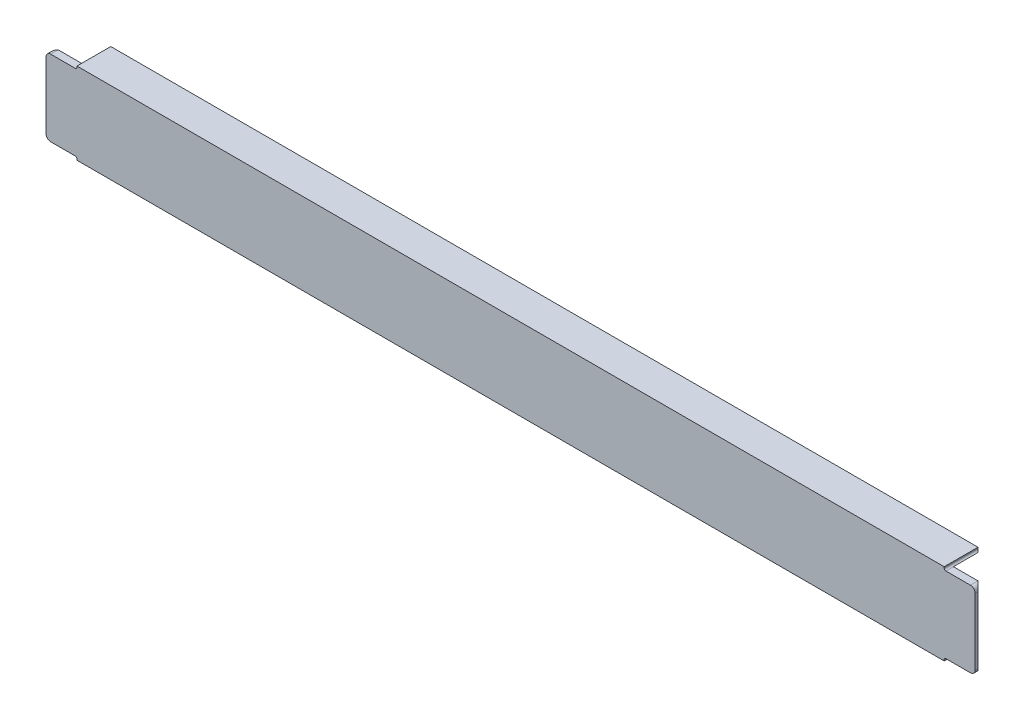
ISO-10303-21;
HEADER;
FILE_DESCRIPTION(('STEP AP214'),'2;1');
FILE_NAME('part.step','',(''),(''),'','','');
FILE_SCHEMA(('AUTOMOTIVE_DESIGN { 1 0 10303 214 1 1 1 1 }'));
ENDSEC;
DATA;
#1=APPLICATION_CONTEXT('core data for automotive mechanical design processes');
#2=APPLICATION_PROTOCOL_DEFINITION('international standard','automotive_design',2000,#1);
#3=PRODUCT_CONTEXT('',#1,'mechanical');
#4=PRODUCT('Part','Part','',(#3));
#5=PRODUCT_RELATED_PRODUCT_CATEGORY('part','',(#4));
#6=PRODUCT_DEFINITION_FORMATION('','',#4);
#7=PRODUCT_DEFINITION_CONTEXT('part definition',#1,'design');
#8=PRODUCT_DEFINITION('design','',#6,#7);
#9=PRODUCT_DEFINITION_SHAPE('','',#8);
#10=(LENGTH_UNIT() NAMED_UNIT(*) SI_UNIT(.MILLI.,.METRE.));
#11=(NAMED_UNIT(*) PLANE_ANGLE_UNIT() SI_UNIT($,.RADIAN.));
#12=(NAMED_UNIT(*) SI_UNIT($,.STERADIAN.) SOLID_ANGLE_UNIT());
#13=UNCERTAINTY_MEASURE_WITH_UNIT(LENGTH_MEASURE(1.E-05),#10,'distance_accuracy_value','');
#14=(GEOMETRIC_REPRESENTATION_CONTEXT(3) GLOBAL_UNCERTAINTY_ASSIGNED_CONTEXT((#13)) GLOBAL_UNIT_ASSIGNED_CONTEXT((#10,
#11,#12)) REPRESENTATION_CONTEXT('',''));
#15=CARTESIAN_POINT('',(0.,0.,0.));
#16=DIRECTION('',(0.,0.,1.));
#17=DIRECTION('',(1.,0.,0.));
#18=AXIS2_PLACEMENT_3D('',#15,#16,#17);
#19=CARTESIAN_POINT('',(-948.422417281431,-4.9,3.));
#20=DIRECTION('',(0.,-1.,0.));
#21=DIRECTION('',(0.,0.,-1.));
#22=AXIS2_PLACEMENT_3D('',#19,#20,#21);
#23=PLANE('',#22);
#24=DIRECTION('',(0.,0.,1.));
#25=VECTOR('',#24,1.);
#26=CARTESIAN_POINT('',(-746.783643365314,-4.89999999999959,-250.));
#27=LINE('',#26,#25);
#28=CARTESIAN_POINT('',(-746.783643365314,-4.89999999999959,3.));
#29=VERTEX_POINT('',#28);
#30=CARTESIAN_POINT('',(-746.783643365314,-4.89999999999959,45.1));
#31=VERTEX_POINT('',#30);
#32=EDGE_CURVE('E295',#29,#31,#27,.T.);
#33=ORIENTED_EDGE('',*,*,#32,.F.);
#34=DIRECTION('',(1.,0.,0.));
#35=VECTOR('',#34,1.);
#36=CARTESIAN_POINT('',(-948.422417281431,-4.9,3.));
#37=LINE('',#36,#35);
#38=CARTESIAN_POINT('',(746.783643365314,-4.89999999999959,3.));
#39=VERTEX_POINT('',#38);
#40=EDGE_CURVE('E359',#29,#39,#37,.T.);
#41=ORIENTED_EDGE('',*,*,#40,.T.);
#42=DIRECTION('',(0.,0.,1.));
#43=VECTOR('',#42,1.);
#44=CARTESIAN_POINT('',(746.783643365314,-4.89999999999959,-250.));
#45=LINE('',#44,#43);
#46=CARTESIAN_POINT('',(746.783643365314,-4.89999999999959,45.1));
#47=VERTEX_POINT('',#46);
#48=EDGE_CURVE('E441',#39,#47,#45,.T.);
#49=ORIENTED_EDGE('',*,*,#48,.T.);
#50=DIRECTION('',(1.,0.,0.));
#51=VECTOR('',#50,1.);
#52=CARTESIAN_POINT('',(-948.422417281431,-4.90000000000001,45.1));
#53=LINE('',#52,#51);
#54=EDGE_CURVE('E362',#31,#47,#53,.T.);
#55=ORIENTED_EDGE('',*,*,#54,.F.);
#56=EDGE_LOOP('',(#33,#41,#49,#55));
#57=FACE_BOUND('',#56,.T.);
#58=ADVANCED_FACE('F41',(#57),#23,.T.);
#59=CARTESIAN_POINT('',(-948.422417281431,-135.1,3.));
#60=DIRECTION('',(0.,1.,0.));
#61=DIRECTION('',(0.,0.,1.));
#62=AXIS2_PLACEMENT_3D('',#59,#60,#61);
#63=PLANE('',#62);
#64=DIRECTION('',(1.,0.,0.));
#65=VECTOR('',#64,1.);
#66=CARTESIAN_POINT('',(-948.422417281431,-135.1,3.));
#67=LINE('',#66,#65);
#68=CARTESIAN_POINT('',(-746.783643365314,-135.1,3.));
#69=VERTEX_POINT('',#68);
#70=CARTESIAN_POINT('',(746.783643365314,-135.1,3.));
#71=VERTEX_POINT('',#70);
#72=EDGE_CURVE('E374',#69,#71,#67,.T.);
#73=ORIENTED_EDGE('',*,*,#72,.F.);
#74=DIRECTION('',(0.,0.,1.));
#75=VECTOR('',#74,1.);
#76=CARTESIAN_POINT('',(-746.783643365314,-135.1,-250.));
#77=LINE('',#76,#75);
#78=CARTESIAN_POINT('',(-746.783643365314,-135.1,45.1));
#79=VERTEX_POINT('',#78);
#80=EDGE_CURVE('E307',#69,#79,#77,.T.);
#81=ORIENTED_EDGE('',*,*,#80,.T.);
#82=DIRECTION('',(1.,0.,0.));
#83=VECTOR('',#82,1.);
#84=CARTESIAN_POINT('',(-948.422417281431,-135.1,45.1));
#85=LINE('',#84,#83);
#86=CARTESIAN_POINT('',(746.783643365314,-135.1,45.1));
#87=VERTEX_POINT('',#86);
#88=EDGE_CURVE('E371',#79,#87,#85,.T.);
#89=ORIENTED_EDGE('',*,*,#88,.T.);
#90=DIRECTION('',(0.,0.,1.));
#91=VECTOR('',#90,1.);
#92=CARTESIAN_POINT('',(746.783643365314,-135.1,-250.));
#93=LINE('',#92,#91);
#94=EDGE_CURVE('E461',#71,#87,#93,.T.);
#95=ORIENTED_EDGE('',*,*,#94,.F.);
#96=EDGE_LOOP('',(#73,#81,#89,#95));
#97=FACE_BOUND('',#96,.T.);
#98=ADVANCED_FACE('F510',(#97),#63,.T.);
#99=CARTESIAN_POINT('',(-796.883643365314,-12.8999999999996,-250.));
#100=DIRECTION('',(1.,0.,0.));
#101=DIRECTION('',(0.,1.,0.));
#102=AXIS2_PLACEMENT_3D('',#99,#100,#101);
#103=PLANE('',#102);
#104=DIRECTION('',(0.,1.,0.));
#105=VECTOR('',#104,1.);
#106=CARTESIAN_POINT('',(-796.883643365314,-140.,57.9999999999999));
#107=LINE('',#106,#105);
#108=CARTESIAN_POINT('',(-796.883643365314,-127.1,57.9999999999999));
#109=VERTEX_POINT('',#108);
#110=CARTESIAN_POINT('',(-796.883643365314,-12.8999999999996,57.9999999999999));
#111=VERTEX_POINT('',#110);
#112=EDGE_CURVE('E352',#109,#111,#107,.T.);
#113=ORIENTED_EDGE('',*,*,#112,.T.);
#114=DIRECTION('',(0.,0.,1.));
#115=VECTOR('',#114,1.);
#116=CARTESIAN_POINT('',(-796.883643365314,-12.8999999999996,-250.));
#117=LINE('',#116,#115);
#118=CARTESIAN_POINT('',(-796.883643365314,-12.9,53.1));
#119=VERTEX_POINT('',#118);
#120=EDGE_CURVE('E389',#111,#119,#117,.F.);
#121=ORIENTED_EDGE('',*,*,#120,.T.);
#122=DIRECTION('',(0.,-1.,0.));
#123=VECTOR('',#122,1.);
#124=CARTESIAN_POINT('',(-796.883643365314,-12.9,53.1));
#125=LINE('',#124,#123);
#126=CARTESIAN_POINT('',(-796.883643365314,-127.1,53.1));
#127=VERTEX_POINT('',#126);
#128=EDGE_CURVE('E348',#119,#127,#125,.T.);
#129=ORIENTED_EDGE('',*,*,#128,.T.);
#130=DIRECTION('',(0.,0.,1.));
#131=VECTOR('',#130,1.);
#132=CARTESIAN_POINT('',(-796.883643365314,-127.1,-250.));
#133=LINE('',#132,#131);
#134=EDGE_CURVE('E386',#109,#127,#133,.F.);
#135=ORIENTED_EDGE('',*,*,#134,.F.);
#136=EDGE_LOOP('',(#113,#121,#129,#135));
#137=FACE_BOUND('',#136,.T.);
#138=ADVANCED_FACE('F515',(#137),#103,.F.);
#139=CARTESIAN_POINT('',(-948.422417281431,0.,57.9999999999999));
#140=DIRECTION('',(0.,1.,0.));
#141=DIRECTION('',(0.,0.,1.));
#142=AXIS2_PLACEMENT_3D('',#139,#140,#141);
#143=PLANE('',#142);
#144=DIRECTION('',(0.,0.,1.));
#145=VECTOR('',#144,1.);
#146=CARTESIAN_POINT('',(-743.783643365314,4.16333634234434E-13,-250.));
#147=LINE('',#146,#145);
#148=CARTESIAN_POINT('',(-743.783643365314,4.16333634234434E-13,0.));
#149=VERTEX_POINT('',#148);
#150=CARTESIAN_POINT('',(-743.783643365314,4.16333634234434E-13,57.9999999999999));
#151=VERTEX_POINT('',#150);
#152=EDGE_CURVE('E287',#149,#151,#147,.T.);
#153=ORIENTED_EDGE('',*,*,#152,.T.);
#154=DIRECTION('',(1.,0.,0.));
#155=VECTOR('',#154,1.);
#156=CARTESIAN_POINT('',(-948.422417281431,0.,57.9999999999999));
#157=LINE('',#156,#155);
#158=CARTESIAN_POINT('',(743.783643365314,4.16333634234434E-13,57.9999999999999));
#159=VERTEX_POINT('',#158);
#160=EDGE_CURVE('E347',#151,#159,#157,.T.);
#161=ORIENTED_EDGE('',*,*,#160,.T.);
#162=DIRECTION('',(0.,0.,1.));
#163=VECTOR('',#162,1.);
#164=CARTESIAN_POINT('',(743.783643365314,4.16333634234434E-13,-250.));
#165=LINE('',#164,#163);
#166=CARTESIAN_POINT('',(743.783643365314,4.16333634234434E-13,0.));
#167=VERTEX_POINT('',#166);
#168=EDGE_CURVE('E424',#167,#159,#165,.T.);
#169=ORIENTED_EDGE('',*,*,#168,.F.);
#170=DIRECTION('',(1.,0.,0.));
#171=VECTOR('',#170,1.);
#172=CARTESIAN_POINT('',(-948.422417281431,0.,0.));
#173=LINE('',#172,#171);
#174=EDGE_CURVE('E353',#149,#167,#173,.T.);
#175=ORIENTED_EDGE('',*,*,#174,.F.);
#176=EDGE_LOOP('',(#153,#161,#169,#175));
#177=FACE_BOUND('',#176,.T.);
#178=ADVANCED_FACE('F43',(#177),#143,.T.);
#179=CARTESIAN_POINT('',(-948.422417281431,0.,0.));
#180=DIRECTION('',(0.,0.,-1.));
#181=DIRECTION('',(0.,1.,0.));
#182=AXIS2_PLACEMENT_3D('',#179,#180,#181);
#183=PLANE('',#182);
#184=DIRECTION('',(0.,-1.,0.));
#185=VECTOR('',#184,1.);
#186=CARTESIAN_POINT('',(-743.783643365314,7.47350916226102E-13,0.));
#187=LINE('',#186,#185);
#188=CARTESIAN_POINT('',(-743.783643365314,-1.89999999999958,0.));
#189=VERTEX_POINT('',#188);
#190=EDGE_CURVE('E344',#149,#189,#187,.T.);
#191=ORIENTED_EDGE('',*,*,#190,.F.);
#192=ORIENTED_EDGE('',*,*,#174,.T.);
#193=DIRECTION('',(0.,-1.,0.));
#194=VECTOR('',#193,1.);
#195=CARTESIAN_POINT('',(743.783643365314,7.47350916226102E-13,0.));
#196=LINE('',#195,#194);
#197=CARTESIAN_POINT('',(743.783643365314,-1.89999999999958,0.));
#198=VERTEX_POINT('',#197);
#199=EDGE_CURVE('E245',#167,#198,#196,.T.);
#200=ORIENTED_EDGE('',*,*,#199,.T.);
#201=DIRECTION('',(1.,0.,0.));
#202=VECTOR('',#201,1.);
#203=CARTESIAN_POINT('',(-948.422417281431,-1.9,0.));
#204=LINE('',#203,#202);
#205=EDGE_CURVE('E356',#189,#198,#204,.T.);
#206=ORIENTED_EDGE('',*,*,#205,.F.);
#207=EDGE_LOOP('',(#191,#192,#200,#206));
#208=FACE_BOUND('',#207,.T.);
#209=ADVANCED_FACE('F427',(#208),#183,.T.);
#210=CARTESIAN_POINT('',(-948.422417281431,-1.9,3.));
#211=DIRECTION('',(1.,0.,0.));
#212=DIRECTION('',(0.,0.,-1.));
#213=AXIS2_PLACEMENT_3D('',#210,#211,#212);
#214=CYLINDRICAL_SURFACE('',#213,3.00000000000001);
#215=CARTESIAN_POINT('',(-746.783643365314,-1.89999999999979,3.));
#216=DIRECTION('',(0.707106781186547,0.,0.707106781186547));
#217=DIRECTION('',(0.707106781186547,0.,-0.707106781186547));
#218=AXIS2_PLACEMENT_3D('',#215,#216,#217);
#219=ELLIPSE('',#218,4.24264068711929,3.00000000000001);
#220=EDGE_CURVE('E341',#189,#29,#219,.F.);
#221=ORIENTED_EDGE('',*,*,#220,.F.);
#222=ORIENTED_EDGE('',*,*,#205,.T.);
#223=CARTESIAN_POINT('',(746.783643365314,-1.89999999999979,3.));
#224=DIRECTION('',(0.707106781186547,0.,-0.707106781186547));
#225=DIRECTION('',(-0.707106781186547,0.,-0.707106781186547));
#226=AXIS2_PLACEMENT_3D('',#223,#224,#225);
#227=ELLIPSE('',#226,4.24264068711929,3.00000000000001);
#228=EDGE_CURVE('E241',#198,#39,#227,.F.);
#229=ORIENTED_EDGE('',*,*,#228,.T.);
#230=ORIENTED_EDGE('',*,*,#40,.F.);
#231=EDGE_LOOP('',(#221,#222,#229,#230));
#232=FACE_BOUND('',#231,.T.);
#233=ADVANCED_FACE('F431',(#232),#214,.T.);
#234=CARTESIAN_POINT('',(-948.422417281431,-12.9,45.1));
#235=DIRECTION('',(1.,0.,0.));
#236=DIRECTION('',(0.,0.,-1.));
#237=AXIS2_PLACEMENT_3D('',#234,#235,#236);
#238=CYLINDRICAL_SURFACE('',#237,8.);
#239=CARTESIAN_POINT('',(-788.883643365314,-12.8999999999998,45.1));
#240=DIRECTION('',(0.707106781186547,0.,0.707106781186547));
#241=DIRECTION('',(0.707106781186547,0.,-0.707106781186547));
#242=AXIS2_PLACEMENT_3D('',#239,#240,#241);
#243=ELLIPSE('',#242,11.3137084989848,8.);
#244=CARTESIAN_POINT('',(-788.883643365314,-4.89999999999959,45.1));
#245=VERTEX_POINT('',#244);
#246=EDGE_CURVE('E65',#245,#119,#243,.T.);
#247=ORIENTED_EDGE('',*,*,#246,.F.);
#248=DIRECTION('',(1.,0.,0.));
#249=VECTOR('',#248,1.);
#250=CARTESIAN_POINT('',(-948.422417281431,-4.8999999999998,45.1));
#251=LINE('',#250,#249);
#252=EDGE_CURVE('E331',#245,#31,#251,.T.);
#253=ORIENTED_EDGE('',*,*,#252,.T.);
#254=ORIENTED_EDGE('',*,*,#54,.T.);
#255=DIRECTION('',(-1.,0.,0.));
#256=VECTOR('',#255,1.);
#257=CARTESIAN_POINT('',(948.422417281431,-4.8999999999998,45.1));
#258=LINE('',#257,#256);
#259=CARTESIAN_POINT('',(788.883643365314,-4.89999999999959,45.1));
#260=VERTEX_POINT('',#259);
#261=EDGE_CURVE('E221',#260,#47,#258,.T.);
#262=ORIENTED_EDGE('',*,*,#261,.F.);
#263=CARTESIAN_POINT('',(788.883643365314,-12.8999999999998,45.1));
#264=DIRECTION('',(0.707106781186547,0.,-0.707106781186547));
#265=DIRECTION('',(-0.707106781186547,0.,-0.707106781186547));
#266=AXIS2_PLACEMENT_3D('',#263,#264,#265);
#267=ELLIPSE('',#266,11.3137084989848,8.);
#268=CARTESIAN_POINT('',(796.883643365314,-12.9,53.1));
#269=VERTEX_POINT('',#268);
#270=EDGE_CURVE('E222',#260,#269,#267,.T.);
#271=ORIENTED_EDGE('',*,*,#270,.T.);
#272=DIRECTION('',(1.,0.,0.));
#273=VECTOR('',#272,1.);
#274=CARTESIAN_POINT('',(-948.422417281431,-12.9,53.1));
#275=LINE('',#274,#273);
#276=EDGE_CURVE('E365',#119,#269,#275,.T.);
#277=ORIENTED_EDGE('',*,*,#276,.F.);
#278=EDGE_LOOP('',(#247,#253,#254,#262,#271,#277));
#279=FACE_BOUND('',#278,.T.);
#280=ADVANCED_FACE('F493',(#279),#238,.F.);
#281=CARTESIAN_POINT('',(-948.422417281431,-12.9,53.1));
#282=DIRECTION('',(0.,0.,-1.));
#283=DIRECTION('',(0.,1.,0.));
#284=AXIS2_PLACEMENT_3D('',#281,#282,#283);
#285=PLANE('',#284);
#286=ORIENTED_EDGE('',*,*,#128,.F.);
#287=ORIENTED_EDGE('',*,*,#276,.T.);
#288=DIRECTION('',(0.,-1.,0.));
#289=VECTOR('',#288,1.);
#290=CARTESIAN_POINT('',(796.883643365314,-12.9,53.1));
#291=LINE('',#290,#289);
#292=CARTESIAN_POINT('',(796.883643365314,-127.1,53.1));
#293=VERTEX_POINT('',#292);
#294=EDGE_CURVE('E249',#269,#293,#291,.T.);
#295=ORIENTED_EDGE('',*,*,#294,.T.);
#296=DIRECTION('',(1.,0.,0.));
#297=VECTOR('',#296,1.);
#298=CARTESIAN_POINT('',(-948.422417281431,-127.1,53.1));
#299=LINE('',#298,#297);
#300=EDGE_CURVE('E368',#127,#293,#299,.T.);
#301=ORIENTED_EDGE('',*,*,#300,.F.);
#302=EDGE_LOOP('',(#286,#287,#295,#301));
#303=FACE_BOUND('',#302,.T.);
#304=ADVANCED_FACE('F489',(#303),#285,.T.);
#305=CARTESIAN_POINT('',(-948.422417281431,-127.1,45.1));
#306=DIRECTION('',(1.,0.,0.));
#307=DIRECTION('',(0.,0.,-1.));
#308=AXIS2_PLACEMENT_3D('',#305,#306,#307);
#309=CYLINDRICAL_SURFACE('',#308,8.);
#310=CARTESIAN_POINT('',(-788.883643365314,-127.1,45.1));
#311=DIRECTION('',(0.707106781186547,0.,0.707106781186547));
#312=DIRECTION('',(0.707106781186547,0.,-0.707106781186547));
#313=AXIS2_PLACEMENT_3D('',#310,#311,#312);
#314=ELLIPSE('',#313,11.3137084989848,8.);
#315=CARTESIAN_POINT('',(-788.883643365314,-135.1,45.1));
#316=VERTEX_POINT('',#315);
#317=EDGE_CURVE('E320',#127,#316,#314,.T.);
#318=ORIENTED_EDGE('',*,*,#317,.F.);
#319=ORIENTED_EDGE('',*,*,#300,.T.);
#320=CARTESIAN_POINT('',(788.883643365314,-127.1,45.1));
#321=DIRECTION('',(0.707106781186547,0.,-0.707106781186547));
#322=DIRECTION('',(-0.707106781186547,0.,-0.707106781186547));
#323=AXIS2_PLACEMENT_3D('',#320,#321,#322);
#324=ELLIPSE('',#323,11.3137084989848,8.);
#325=CARTESIAN_POINT('',(788.883643365314,-135.1,45.1));
#326=VERTEX_POINT('',#325);
#327=EDGE_CURVE('E470',#293,#326,#324,.T.);
#328=ORIENTED_EDGE('',*,*,#327,.T.);
#329=DIRECTION('',(-1.,0.,0.));
#330=VECTOR('',#329,1.);
#331=CARTESIAN_POINT('',(948.422417281431,-135.1,45.1));
#332=LINE('',#331,#330);
#333=EDGE_CURVE('E237',#326,#87,#332,.T.);
#334=ORIENTED_EDGE('',*,*,#333,.T.);
#335=ORIENTED_EDGE('',*,*,#88,.F.);
#336=DIRECTION('',(1.,0.,0.));
#337=VECTOR('',#336,1.);
#338=CARTESIAN_POINT('',(-948.422417281431,-135.1,45.1));
#339=LINE('',#338,#337);
#340=EDGE_CURVE('E338',#316,#79,#339,.T.);
#341=ORIENTED_EDGE('',*,*,#340,.F.);
#342=EDGE_LOOP('',(#318,#319,#328,#334,#335,#341));
#343=FACE_BOUND('',#342,.T.);
#344=ADVANCED_FACE('F526',(#343),#309,.F.);
#345=CARTESIAN_POINT('',(-948.422417281431,-138.1,3.));
#346=DIRECTION('',(1.,0.,0.));
#347=DIRECTION('',(0.,0.,-1.));
#348=AXIS2_PLACEMENT_3D('',#345,#346,#347);
#349=CYLINDRICAL_SURFACE('',#348,3.);
#350=CARTESIAN_POINT('',(-746.783643365314,-138.1,3.));
#351=DIRECTION('',(0.707106781186547,0.,0.707106781186547));
#352=DIRECTION('',(0.707106781186547,0.,-0.707106781186547));
#353=AXIS2_PLACEMENT_3D('',#350,#351,#352);
#354=ELLIPSE('',#353,4.24264068711928,3.);
#355=CARTESIAN_POINT('',(-743.783643365314,-138.1,0.));
#356=VERTEX_POINT('',#355);
#357=EDGE_CURVE('E335',#69,#356,#354,.F.);
#358=ORIENTED_EDGE('',*,*,#357,.F.);
#359=ORIENTED_EDGE('',*,*,#72,.T.);
#360=CARTESIAN_POINT('',(746.783643365314,-138.1,3.));
#361=DIRECTION('',(0.707106781186547,0.,-0.707106781186547));
#362=DIRECTION('',(-0.707106781186547,0.,-0.707106781186547));
#363=AXIS2_PLACEMENT_3D('',#360,#361,#362);
#364=ELLIPSE('',#363,4.24264068711928,3.);
#365=CARTESIAN_POINT('',(743.783643365314,-138.1,0.));
#366=VERTEX_POINT('',#365);
#367=EDGE_CURVE('E228',#71,#366,#364,.F.);
#368=ORIENTED_EDGE('',*,*,#367,.T.);
#369=DIRECTION('',(1.,0.,0.));
#370=VECTOR('',#369,1.);
#371=CARTESIAN_POINT('',(-948.422417281431,-138.1,0.));
#372=LINE('',#371,#370);
#373=EDGE_CURVE('E203',#356,#366,#372,.T.);
#374=ORIENTED_EDGE('',*,*,#373,.F.);
#375=EDGE_LOOP('',(#358,#359,#368,#374));
#376=FACE_BOUND('',#375,.T.);
#377=ADVANCED_FACE('F528',(#376),#349,.T.);
#378=CARTESIAN_POINT('',(-948.422417281431,-140.,0.));
#379=DIRECTION('',(0.,0.,-1.));
#380=DIRECTION('',(0.,1.,0.));
#381=AXIS2_PLACEMENT_3D('',#378,#379,#380);
#382=PLANE('',#381);
#383=DIRECTION('',(0.,-1.,0.));
#384=VECTOR('',#383,1.);
#385=CARTESIAN_POINT('',(-743.783643365314,-139.999999999999,0.));
#386=LINE('',#385,#384);
#387=CARTESIAN_POINT('',(-743.783643365314,-140.,0.));
#388=VERTEX_POINT('',#387);
#389=EDGE_CURVE('E328',#356,#388,#386,.T.);
#390=ORIENTED_EDGE('',*,*,#389,.F.);
#391=ORIENTED_EDGE('',*,*,#373,.T.);
#392=DIRECTION('',(0.,-1.,0.));
#393=VECTOR('',#392,1.);
#394=CARTESIAN_POINT('',(743.783643365314,-139.999999999999,0.));
#395=LINE('',#394,#393);
#396=CARTESIAN_POINT('',(743.783643365314,-140.,0.));
#397=VERTEX_POINT('',#396);
#398=EDGE_CURVE('E210',#366,#397,#395,.T.);
#399=ORIENTED_EDGE('',*,*,#398,.T.);
#400=DIRECTION('',(1.,0.,0.));
#401=VECTOR('',#400,1.);
#402=CARTESIAN_POINT('',(-948.422417281431,-140.,0.));
#403=LINE('',#402,#401);
#404=EDGE_CURVE('E193',#388,#397,#403,.T.);
#405=ORIENTED_EDGE('',*,*,#404,.F.);
#406=EDGE_LOOP('',(#390,#391,#399,#405));
#407=FACE_BOUND('',#406,.T.);
#408=ADVANCED_FACE('F217',(#407),#382,.T.);
#409=CARTESIAN_POINT('',(-948.422417281431,-140.,57.9999999999999));
#410=DIRECTION('',(0.,-1.,0.));
#411=DIRECTION('',(0.,0.,-1.));
#412=AXIS2_PLACEMENT_3D('',#409,#410,#411);
#413=PLANE('',#412);
#414=DIRECTION('',(0.,0.,1.));
#415=VECTOR('',#414,1.);
#416=CARTESIAN_POINT('',(-743.783643365314,-140.,-250.));
#417=LINE('',#416,#415);
#418=CARTESIAN_POINT('',(-743.783643365314,-140.,57.9999999999999));
#419=VERTEX_POINT('',#418);
#420=EDGE_CURVE('E198',#388,#419,#417,.T.);
#421=ORIENTED_EDGE('',*,*,#420,.F.);
#422=ORIENTED_EDGE('',*,*,#404,.T.);
#423=DIRECTION('',(0.,0.,1.));
#424=VECTOR('',#423,1.);
#425=CARTESIAN_POINT('',(743.783643365314,-140.,-250.));
#426=LINE('',#425,#424);
#427=CARTESIAN_POINT('',(743.783643365314,-140.,57.9999999999999));
#428=VERTEX_POINT('',#427);
#429=EDGE_CURVE('E197',#397,#428,#426,.T.);
#430=ORIENTED_EDGE('',*,*,#429,.T.);
#431=DIRECTION('',(1.,0.,0.));
#432=VECTOR('',#431,1.);
#433=CARTESIAN_POINT('',(-948.422417281431,-140.,57.9999999999999));
#434=LINE('',#433,#432);
#435=EDGE_CURVE('E204',#419,#428,#434,.T.);
#436=ORIENTED_EDGE('',*,*,#435,.F.);
#437=EDGE_LOOP('',(#421,#422,#430,#436));
#438=FACE_BOUND('',#437,.T.);
#439=ADVANCED_FACE('F195',(#438),#413,.T.);
#440=CARTESIAN_POINT('',(-948.422417281431,-140.,57.9999999999999));
#441=DIRECTION('',(0.,0.,1.));
#442=DIRECTION('',(0.,-1.,0.));
#443=AXIS2_PLACEMENT_3D('',#440,#441,#442);
#444=PLANE('',#443);
#445=DIRECTION('',(0.,1.,0.));
#446=VECTOR('',#445,1.);
#447=CARTESIAN_POINT('',(-743.783643365314,-139.999999999999,57.9999999999999));
#448=LINE('',#447,#446);
#449=CARTESIAN_POINT('',(-743.783643365314,-1.89999999999958,57.9999999999999));
#450=VERTEX_POINT('',#449);
#451=EDGE_CURVE('E11',#450,#151,#448,.T.);
#452=ORIENTED_EDGE('',*,*,#451,.F.);
#453=CARTESIAN_POINT('',(-746.783643365314,-1.89999999999958,57.9999999999999));
#454=DIRECTION('',(0.,0.,1.));
#455=DIRECTION('',(0.,-1.,0.));
#456=AXIS2_PLACEMENT_3D('',#453,#454,#455);
#457=CIRCLE('',#456,3.00000000000001);
#458=CARTESIAN_POINT('',(-746.783643365314,-4.89999999999959,57.9999999999999));
#459=VERTEX_POINT('',#458);
#460=EDGE_CURVE('E50',#459,#450,#457,.T.);
#461=ORIENTED_EDGE('',*,*,#460,.F.);
#462=DIRECTION('',(1.,0.,0.));
#463=VECTOR('',#462,1.);
#464=CARTESIAN_POINT('',(-948.422417281431,-4.8999999999996,57.9999999999999));
#465=LINE('',#464,#463);
#466=CARTESIAN_POINT('',(-788.883643365314,-4.89999999999959,57.9999999999999));
#467=VERTEX_POINT('',#466);
#468=EDGE_CURVE('E401',#467,#459,#465,.T.);
#469=ORIENTED_EDGE('',*,*,#468,.F.);
#470=CARTESIAN_POINT('',(-788.883643365314,-12.8999999999996,57.9999999999999));
#471=DIRECTION('',(0.,0.,1.));
#472=DIRECTION('',(0.,-1.,0.));
#473=AXIS2_PLACEMENT_3D('',#470,#471,#472);
#474=CIRCLE('',#473,8.);
#475=EDGE_CURVE('E323',#111,#467,#474,.F.);
#476=ORIENTED_EDGE('',*,*,#475,.F.);
#477=ORIENTED_EDGE('',*,*,#112,.F.);
#478=CARTESIAN_POINT('',(-788.883643365314,-127.1,57.9999999999999));
#479=DIRECTION('',(0.,0.,1.));
#480=DIRECTION('',(0.,-1.,0.));
#481=AXIS2_PLACEMENT_3D('',#478,#479,#480);
#482=CIRCLE('',#481,8.);
#483=CARTESIAN_POINT('',(-788.883643365314,-135.1,57.9999999999999));
#484=VERTEX_POINT('',#483);
#485=EDGE_CURVE('E57',#484,#109,#482,.F.);
#486=ORIENTED_EDGE('',*,*,#485,.F.);
#487=DIRECTION('',(-1.,0.,0.));
#488=VECTOR('',#487,1.);
#489=CARTESIAN_POINT('',(-948.422417281431,-135.099999999999,57.9999999999999));
#490=LINE('',#489,#488);
#491=CARTESIAN_POINT('',(-746.783643365314,-135.1,57.9999999999999));
#492=VERTEX_POINT('',#491);
#493=EDGE_CURVE('E398',#492,#484,#490,.T.);
#494=ORIENTED_EDGE('',*,*,#493,.F.);
#495=CARTESIAN_POINT('',(-746.783643365314,-138.1,57.9999999999999));
#496=DIRECTION('',(0.,0.,1.));
#497=DIRECTION('',(0.,-1.,0.));
#498=AXIS2_PLACEMENT_3D('',#495,#496,#497);
#499=CIRCLE('',#498,2.99999999999999);
#500=CARTESIAN_POINT('',(-743.783643365314,-138.1,57.9999999999999));
#501=VERTEX_POINT('',#500);
#502=EDGE_CURVE('E395',#501,#492,#499,.T.);
#503=ORIENTED_EDGE('',*,*,#502,.F.);
#504=DIRECTION('',(0.,1.,0.));
#505=VECTOR('',#504,1.);
#506=CARTESIAN_POINT('',(-743.783643365314,-139.999999999999,57.9999999999999));
#507=LINE('',#506,#505);
#508=EDGE_CURVE('E392',#419,#501,#507,.T.);
#509=ORIENTED_EDGE('',*,*,#508,.F.);
#510=ORIENTED_EDGE('',*,*,#435,.T.);
#511=DIRECTION('',(0.,1.,0.));
#512=VECTOR('',#511,1.);
#513=CARTESIAN_POINT('',(743.783643365314,-139.999999999999,57.9999999999999));
#514=LINE('',#513,#512);
#515=CARTESIAN_POINT('',(743.783643365314,-138.1,57.9999999999999));
#516=VERTEX_POINT('',#515);
#517=EDGE_CURVE('E213',#428,#516,#514,.T.);
#518=ORIENTED_EDGE('',*,*,#517,.T.);
#519=CARTESIAN_POINT('',(746.783643365314,-138.1,57.9999999999999));
#520=DIRECTION('',(0.,0.,-1.));
#521=DIRECTION('',(0.,-1.,0.));
#522=AXIS2_PLACEMENT_3D('',#519,#520,#521);
#523=CIRCLE('',#522,2.99999999999999);
#524=CARTESIAN_POINT('',(746.783643365314,-135.1,57.9999999999999));
#525=VERTEX_POINT('',#524);
#526=EDGE_CURVE('E267',#516,#525,#523,.T.);
#527=ORIENTED_EDGE('',*,*,#526,.T.);
#528=DIRECTION('',(1.,0.,0.));
#529=VECTOR('',#528,1.);
#530=CARTESIAN_POINT('',(948.422417281431,-135.099999999999,57.9999999999999));
#531=LINE('',#530,#529);
#532=CARTESIAN_POINT('',(788.883643365314,-135.1,57.9999999999999));
#533=VERTEX_POINT('',#532);
#534=EDGE_CURVE('E271',#525,#533,#531,.T.);
#535=ORIENTED_EDGE('',*,*,#534,.T.);
#536=CARTESIAN_POINT('',(788.883643365314,-127.1,57.9999999999999));
#537=DIRECTION('',(0.,0.,-1.));
#538=DIRECTION('',(0.,-1.,0.));
#539=AXIS2_PLACEMENT_3D('',#536,#537,#538);
#540=CIRCLE('',#539,8.);
#541=CARTESIAN_POINT('',(796.883643365314,-127.1,57.9999999999999));
#542=VERTEX_POINT('',#541);
#543=EDGE_CURVE('E467',#533,#542,#540,.F.);
#544=ORIENTED_EDGE('',*,*,#543,.T.);
#545=DIRECTION('',(0.,1.,0.));
#546=VECTOR('',#545,1.);
#547=CARTESIAN_POINT('',(796.883643365314,-140.,57.9999999999999));
#548=LINE('',#547,#546);
#549=CARTESIAN_POINT('',(796.883643365314,-12.8999999999996,57.9999999999999));
#550=VERTEX_POINT('',#549);
#551=EDGE_CURVE('E253',#542,#550,#548,.T.);
#552=ORIENTED_EDGE('',*,*,#551,.T.);
#553=CARTESIAN_POINT('',(788.883643365314,-12.8999999999996,57.9999999999999));
#554=DIRECTION('',(0.,0.,-1.));
#555=DIRECTION('',(0.,-1.,0.));
#556=AXIS2_PLACEMENT_3D('',#553,#554,#555);
#557=CIRCLE('',#556,8.);
#558=CARTESIAN_POINT('',(788.883643365314,-4.89999999999959,57.9999999999999));
#559=VERTEX_POINT('',#558);
#560=EDGE_CURVE('E231',#550,#559,#557,.F.);
#561=ORIENTED_EDGE('',*,*,#560,.T.);
#562=DIRECTION('',(-1.,0.,0.));
#563=VECTOR('',#562,1.);
#564=CARTESIAN_POINT('',(948.422417281431,-4.8999999999996,57.9999999999999));
#565=LINE('',#564,#563);
#566=CARTESIAN_POINT('',(746.783643365314,-4.89999999999959,57.9999999999999));
#567=VERTEX_POINT('',#566);
#568=EDGE_CURVE('E275',#559,#567,#565,.T.);
#569=ORIENTED_EDGE('',*,*,#568,.T.);
#570=CARTESIAN_POINT('',(746.783643365314,-1.89999999999958,57.9999999999999));
#571=DIRECTION('',(0.,0.,-1.));
#572=DIRECTION('',(0.,-1.,0.));
#573=AXIS2_PLACEMENT_3D('',#570,#571,#572);
#574=CIRCLE('',#573,3.00000000000001);
#575=CARTESIAN_POINT('',(743.783643365314,-1.89999999999958,57.9999999999999));
#576=VERTEX_POINT('',#575);
#577=EDGE_CURVE('E279',#567,#576,#574,.T.);
#578=ORIENTED_EDGE('',*,*,#577,.T.);
#579=DIRECTION('',(0.,1.,0.));
#580=VECTOR('',#579,1.);
#581=CARTESIAN_POINT('',(743.783643365314,-139.999999999999,57.9999999999999));
#582=LINE('',#581,#580);
#583=EDGE_CURVE('E283',#576,#159,#582,.T.);
#584=ORIENTED_EDGE('',*,*,#583,.T.);
#585=ORIENTED_EDGE('',*,*,#160,.F.);
#586=EDGE_LOOP('',(#452,#461,#469,#476,#477,#486,#494,#503,#509,#510,#518,#527,#535,#544,#552,
#561,#569,#578,#584,#585));
#587=FACE_BOUND('',#586,.T.);
#588=ADVANCED_FACE('F418',(#587),#444,.T.);
#589=CARTESIAN_POINT('',(-743.783643365314,-140.,-250.));
#590=DIRECTION('',(1.,0.,0.));
#591=DIRECTION('',(0.,1.,0.));
#592=AXIS2_PLACEMENT_3D('',#589,#590,#591);
#593=PLANE('',#592);
#594=ORIENTED_EDGE('',*,*,#389,.T.);
#595=ORIENTED_EDGE('',*,*,#420,.T.);
#596=ORIENTED_EDGE('',*,*,#508,.T.);
#597=DIRECTION('',(0.,0.,1.));
#598=VECTOR('',#597,1.);
#599=CARTESIAN_POINT('',(-743.783643365314,-138.1,-250.));
#600=LINE('',#599,#598);
#601=EDGE_CURVE('E312',#356,#501,#600,.T.);
#602=ORIENTED_EDGE('',*,*,#601,.F.);
#603=EDGE_LOOP('',(#594,#595,#596,#602));
#604=FACE_BOUND('',#603,.T.);
#605=ADVANCED_FACE('F538',(#604),#593,.F.);
#606=CARTESIAN_POINT('',(-746.783643365314,-138.1,-250.));
#607=DIRECTION('',(0.,0.,1.));
#608=DIRECTION('',(1.,0.,0.));
#609=AXIS2_PLACEMENT_3D('',#606,#607,#608);
#610=CYLINDRICAL_SURFACE('',#609,2.99999999999999);
#611=ORIENTED_EDGE('',*,*,#357,.T.);
#612=ORIENTED_EDGE('',*,*,#601,.T.);
#613=ORIENTED_EDGE('',*,*,#502,.T.);
#614=EDGE_CURVE('E308',#79,#492,#77,.T.);
#615=ORIENTED_EDGE('',*,*,#614,.F.);
#616=ORIENTED_EDGE('',*,*,#80,.F.);
#617=EDGE_LOOP('',(#611,#612,#613,#615,#616));
#618=FACE_BOUND('',#617,.T.);
#619=ADVANCED_FACE('F542',(#618),#610,.F.);
#620=CARTESIAN_POINT('',(-788.883643365314,-127.1,-250.));
#621=DIRECTION('',(0.,0.,1.));
#622=DIRECTION('',(1.,0.,0.));
#623=AXIS2_PLACEMENT_3D('',#620,#621,#622);
#624=CYLINDRICAL_SURFACE('',#623,8.);
#625=ORIENTED_EDGE('',*,*,#317,.T.);
#626=DIRECTION('',(0.,0.,1.));
#627=VECTOR('',#626,1.);
#628=CARTESIAN_POINT('',(-788.883643365314,-135.1,-250.));
#629=LINE('',#628,#627);
#630=EDGE_CURVE('E304',#316,#484,#629,.T.);
#631=ORIENTED_EDGE('',*,*,#630,.T.);
#632=ORIENTED_EDGE('',*,*,#485,.T.);
#633=ORIENTED_EDGE('',*,*,#134,.T.);
#634=EDGE_LOOP('',(#625,#631,#632,#633));
#635=FACE_BOUND('',#634,.T.);
#636=ADVANCED_FACE('F548',(#635),#624,.T.);
#637=CARTESIAN_POINT('',(-746.783643365314,-135.1,-250.));
#638=DIRECTION('',(0.,1.,0.));
#639=DIRECTION('',(-1.,0.,0.));
#640=AXIS2_PLACEMENT_3D('',#637,#638,#639);
#641=PLANE('',#640);
#642=ORIENTED_EDGE('',*,*,#340,.T.);
#643=ORIENTED_EDGE('',*,*,#614,.T.);
#644=ORIENTED_EDGE('',*,*,#493,.T.);
#645=ORIENTED_EDGE('',*,*,#630,.F.);
#646=EDGE_LOOP('',(#642,#643,#644,#645));
#647=FACE_BOUND('',#646,.T.);
#648=ADVANCED_FACE('F613',(#647),#641,.F.);
#649=CARTESIAN_POINT('',(-746.783643365314,-4.89999999999959,-250.));
#650=DIRECTION('',(0.,-1.,0.));
#651=DIRECTION('',(0.,0.,-1.));
#652=AXIS2_PLACEMENT_3D('',#649,#650,#651);
#653=PLANE('',#652);
#654=DIRECTION('',(0.,0.,1.));
#655=VECTOR('',#654,1.);
#656=CARTESIAN_POINT('',(-788.883643365314,-4.89999999999959,-250.));
#657=LINE('',#656,#655);
#658=EDGE_CURVE('E300',#245,#467,#657,.T.);
#659=ORIENTED_EDGE('',*,*,#658,.T.);
#660=ORIENTED_EDGE('',*,*,#468,.T.);
#661=EDGE_CURVE('E296',#31,#459,#27,.T.);
#662=ORIENTED_EDGE('',*,*,#661,.F.);
#663=ORIENTED_EDGE('',*,*,#252,.F.);
#664=EDGE_LOOP('',(#659,#660,#662,#663));
#665=FACE_BOUND('',#664,.T.);
#666=ADVANCED_FACE('F605',(#665),#653,.F.);
#667=CARTESIAN_POINT('',(-743.783643365314,4.16333634234434E-13,-250.));
#668=DIRECTION('',(1.,0.,0.));
#669=DIRECTION('',(0.,1.,0.));
#670=AXIS2_PLACEMENT_3D('',#667,#668,#669);
#671=PLANE('',#670);
#672=ORIENTED_EDGE('',*,*,#190,.T.);
#673=DIRECTION('',(0.,0.,1.));
#674=VECTOR('',#673,1.);
#675=CARTESIAN_POINT('',(-743.783643365314,-1.89999999999958,-250.));
#676=LINE('',#675,#674);
#677=EDGE_CURVE('E291',#189,#450,#676,.T.);
#678=ORIENTED_EDGE('',*,*,#677,.T.);
#679=ORIENTED_EDGE('',*,*,#451,.T.);
#680=ORIENTED_EDGE('',*,*,#152,.F.);
#681=EDGE_LOOP('',(#672,#678,#679,#680));
#682=FACE_BOUND('',#681,.T.);
#683=ADVANCED_FACE('F415',(#682),#671,.F.);
#684=CARTESIAN_POINT('',(-746.783643365314,-1.89999999999958,-250.));
#685=DIRECTION('',(0.,0.,1.));
#686=DIRECTION('',(1.,0.,0.));
#687=AXIS2_PLACEMENT_3D('',#684,#685,#686);
#688=CYLINDRICAL_SURFACE('',#687,3.00000000000001);
#689=ORIENTED_EDGE('',*,*,#220,.T.);
#690=ORIENTED_EDGE('',*,*,#32,.T.);
#691=ORIENTED_EDGE('',*,*,#661,.T.);
#692=ORIENTED_EDGE('',*,*,#460,.T.);
#693=ORIENTED_EDGE('',*,*,#677,.F.);
#694=EDGE_LOOP('',(#689,#690,#691,#692,#693));
#695=FACE_BOUND('',#694,.T.);
#696=ADVANCED_FACE('F408',(#695),#688,.F.);
#697=CARTESIAN_POINT('',(-788.883643365314,-12.8999999999996,-250.));
#698=DIRECTION('',(0.,0.,1.));
#699=DIRECTION('',(1.,0.,0.));
#700=AXIS2_PLACEMENT_3D('',#697,#698,#699);
#701=CYLINDRICAL_SURFACE('',#700,8.);
#702=ORIENTED_EDGE('',*,*,#246,.T.);
#703=ORIENTED_EDGE('',*,*,#120,.F.);
#704=ORIENTED_EDGE('',*,*,#475,.T.);
#705=ORIENTED_EDGE('',*,*,#658,.F.);
#706=EDGE_LOOP('',(#702,#703,#704,#705));
#707=FACE_BOUND('',#706,.T.);
#708=ADVANCED_FACE('F584',(#707),#701,.T.);
#709=CARTESIAN_POINT('',(796.883643365314,-12.8999999999996,-250.));
#710=DIRECTION('',(-1.,0.,0.));
#711=DIRECTION('',(0.,1.,0.));
#712=AXIS2_PLACEMENT_3D('',#709,#710,#711);
#713=PLANE('',#712);
#714=ORIENTED_EDGE('',*,*,#551,.F.);
#715=DIRECTION('',(0.,0.,1.));
#716=VECTOR('',#715,1.);
#717=CARTESIAN_POINT('',(796.883643365314,-127.1,-250.));
#718=LINE('',#717,#716);
#719=EDGE_CURVE('E257',#542,#293,#718,.F.);
#720=ORIENTED_EDGE('',*,*,#719,.T.);
#721=ORIENTED_EDGE('',*,*,#294,.F.);
#722=DIRECTION('',(0.,0.,1.));
#723=VECTOR('',#722,1.);
#724=CARTESIAN_POINT('',(796.883643365314,-12.8999999999996,-250.));
#725=LINE('',#724,#723);
#726=EDGE_CURVE('E261',#550,#269,#725,.F.);
#727=ORIENTED_EDGE('',*,*,#726,.F.);
#728=EDGE_LOOP('',(#714,#720,#721,#727));
#729=FACE_BOUND('',#728,.T.);
#730=ADVANCED_FACE('F484',(#729),#713,.F.);
#731=CARTESIAN_POINT('',(743.783643365314,-140.,-250.));
#732=DIRECTION('',(-1.,0.,0.));
#733=DIRECTION('',(0.,1.,0.));
#734=AXIS2_PLACEMENT_3D('',#731,#732,#733);
#735=PLANE('',#734);
#736=ORIENTED_EDGE('',*,*,#398,.F.);
#737=DIRECTION('',(0.,0.,1.));
#738=VECTOR('',#737,1.);
#739=CARTESIAN_POINT('',(743.783643365314,-138.1,-250.));
#740=LINE('',#739,#738);
#741=EDGE_CURVE('E215',#366,#516,#740,.T.);
#742=ORIENTED_EDGE('',*,*,#741,.T.);
#743=ORIENTED_EDGE('',*,*,#517,.F.);
#744=ORIENTED_EDGE('',*,*,#429,.F.);
#745=EDGE_LOOP('',(#736,#742,#743,#744));
#746=FACE_BOUND('',#745,.T.);
#747=ADVANCED_FACE('F209',(#746),#735,.F.);
#748=CARTESIAN_POINT('',(746.783643365314,-138.1,-250.));
#749=DIRECTION('',(0.,0.,1.));
#750=DIRECTION('',(-1.,0.,0.));
#751=AXIS2_PLACEMENT_3D('',#748,#749,#750);
#752=CYLINDRICAL_SURFACE('',#751,2.99999999999999);
#753=ORIENTED_EDGE('',*,*,#367,.F.);
#754=ORIENTED_EDGE('',*,*,#94,.T.);
#755=EDGE_CURVE('E462',#87,#525,#93,.T.);
#756=ORIENTED_EDGE('',*,*,#755,.T.);
#757=ORIENTED_EDGE('',*,*,#526,.F.);
#758=ORIENTED_EDGE('',*,*,#741,.F.);
#759=EDGE_LOOP('',(#753,#754,#756,#757,#758));
#760=FACE_BOUND('',#759,.T.);
#761=ADVANCED_FACE('F738',(#760),#752,.F.);
#762=CARTESIAN_POINT('',(788.883643365314,-127.1,-250.));
#763=DIRECTION('',(0.,0.,1.));
#764=DIRECTION('',(-1.,0.,0.));
#765=AXIS2_PLACEMENT_3D('',#762,#763,#764);
#766=CYLINDRICAL_SURFACE('',#765,8.);
#767=ORIENTED_EDGE('',*,*,#327,.F.);
#768=ORIENTED_EDGE('',*,*,#719,.F.);
#769=ORIENTED_EDGE('',*,*,#543,.F.);
#770=DIRECTION('',(0.,0.,1.));
#771=VECTOR('',#770,1.);
#772=CARTESIAN_POINT('',(788.883643365314,-135.1,-250.));
#773=LINE('',#772,#771);
#774=EDGE_CURVE('E458',#326,#533,#773,.T.);
#775=ORIENTED_EDGE('',*,*,#774,.F.);
#776=EDGE_LOOP('',(#767,#768,#769,#775));
#777=FACE_BOUND('',#776,.T.);
#778=ADVANCED_FACE('F504',(#777),#766,.T.);
#779=CARTESIAN_POINT('',(746.783643365314,-135.1,-250.));
#780=DIRECTION('',(0.,1.,0.));
#781=DIRECTION('',(1.,0.,0.));
#782=AXIS2_PLACEMENT_3D('',#779,#780,#781);
#783=PLANE('',#782);
#784=ORIENTED_EDGE('',*,*,#333,.F.);
#785=ORIENTED_EDGE('',*,*,#774,.T.);
#786=ORIENTED_EDGE('',*,*,#534,.F.);
#787=ORIENTED_EDGE('',*,*,#755,.F.);
#788=EDGE_LOOP('',(#784,#785,#786,#787));
#789=FACE_BOUND('',#788,.T.);
#790=ADVANCED_FACE('F497',(#789),#783,.F.);
#791=CARTESIAN_POINT('',(746.783643365314,-4.89999999999959,-250.));
#792=DIRECTION('',(0.,-1.,0.));
#793=DIRECTION('',(0.,0.,-1.));
#794=AXIS2_PLACEMENT_3D('',#791,#792,#793);
#795=PLANE('',#794);
#796=DIRECTION('',(0.,0.,1.));
#797=VECTOR('',#796,1.);
#798=CARTESIAN_POINT('',(788.883643365314,-4.89999999999959,-250.));
#799=LINE('',#798,#797);
#800=EDGE_CURVE('E453',#260,#559,#799,.T.);
#801=ORIENTED_EDGE('',*,*,#800,.F.);
#802=ORIENTED_EDGE('',*,*,#261,.T.);
#803=EDGE_CURVE('E446',#47,#567,#45,.T.);
#804=ORIENTED_EDGE('',*,*,#803,.T.);
#805=ORIENTED_EDGE('',*,*,#568,.F.);
#806=EDGE_LOOP('',(#801,#802,#804,#805));
#807=FACE_BOUND('',#806,.T.);
#808=ADVANCED_FACE('F495',(#807),#795,.F.);
#809=CARTESIAN_POINT('',(743.783643365314,4.16333634234434E-13,-250.));
#810=DIRECTION('',(-1.,0.,0.));
#811=DIRECTION('',(0.,1.,0.));
#812=AXIS2_PLACEMENT_3D('',#809,#810,#811);
#813=PLANE('',#812);
#814=ORIENTED_EDGE('',*,*,#199,.F.);
#815=ORIENTED_EDGE('',*,*,#168,.T.);
#816=ORIENTED_EDGE('',*,*,#583,.F.);
#817=DIRECTION('',(0.,0.,1.));
#818=VECTOR('',#817,1.);
#819=CARTESIAN_POINT('',(743.783643365314,-1.89999999999958,-250.));
#820=LINE('',#819,#818);
#821=EDGE_CURVE('E436',#198,#576,#820,.T.);
#822=ORIENTED_EDGE('',*,*,#821,.F.);
#823=EDGE_LOOP('',(#814,#815,#816,#822));
#824=FACE_BOUND('',#823,.T.);
#825=ADVANCED_FACE('F437',(#824),#813,.F.);
#826=CARTESIAN_POINT('',(746.783643365314,-1.89999999999958,-250.));
#827=DIRECTION('',(0.,0.,1.));
#828=DIRECTION('',(-1.,0.,0.));
#829=AXIS2_PLACEMENT_3D('',#826,#827,#828);
#830=CYLINDRICAL_SURFACE('',#829,3.00000000000001);
#831=ORIENTED_EDGE('',*,*,#228,.F.);
#832=ORIENTED_EDGE('',*,*,#821,.T.);
#833=ORIENTED_EDGE('',*,*,#577,.F.);
#834=ORIENTED_EDGE('',*,*,#803,.F.);
#835=ORIENTED_EDGE('',*,*,#48,.F.);
#836=EDGE_LOOP('',(#831,#832,#833,#834,#835));
#837=FACE_BOUND('',#836,.T.);
#838=ADVANCED_FACE('F443',(#837),#830,.F.);
#839=CARTESIAN_POINT('',(788.883643365314,-12.8999999999996,-250.));
#840=DIRECTION('',(0.,0.,1.));
#841=DIRECTION('',(-1.,0.,0.));
#842=AXIS2_PLACEMENT_3D('',#839,#840,#841);
#843=CYLINDRICAL_SURFACE('',#842,8.);
#844=ORIENTED_EDGE('',*,*,#270,.F.);
#845=ORIENTED_EDGE('',*,*,#800,.T.);
#846=ORIENTED_EDGE('',*,*,#560,.F.);
#847=ORIENTED_EDGE('',*,*,#726,.T.);
#848=EDGE_LOOP('',(#844,#845,#846,#847));
#849=FACE_BOUND('',#848,.T.);
#850=ADVANCED_FACE('F481',(#849),#843,.T.);
#851=CLOSED_SHELL('',(#58,#98,#138,#178,#209,#233,#280,#304,#344,#377,#408,#439,#588,#605,#619,
#636,#648,#666,#683,#696,#708,#730,#747,#761,#778,#790,#808,#825,#838,#850));
#852=MANIFOLD_SOLID_BREP('B2',#851);
#853=ADVANCED_BREP_SHAPE_REPRESENTATION('',(#18,#852),#14);
#854=SHAPE_DEFINITION_REPRESENTATION(#9,#853);
ENDSEC;
END-ISO-10303-21;
